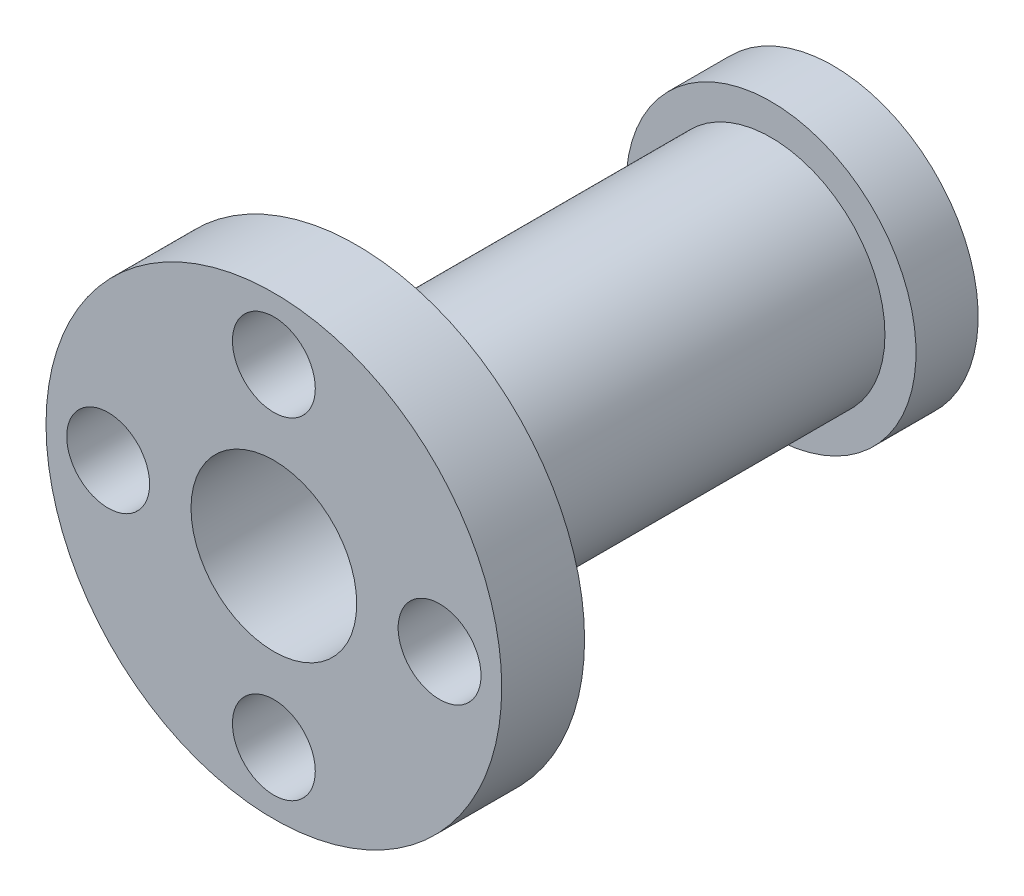
ISO-10303-21;
HEADER;
FILE_DESCRIPTION(('STEP AP214'),'2;1');
FILE_NAME('part.step','',(''),(''),'','','');
FILE_SCHEMA(('AUTOMOTIVE_DESIGN { 1 0 10303 214 1 1 1 1 }'));
ENDSEC;
DATA;
#1=APPLICATION_CONTEXT('core data for automotive mechanical design processes');
#2=APPLICATION_PROTOCOL_DEFINITION('international standard','automotive_design',2000,#1);
#3=PRODUCT_CONTEXT('',#1,'mechanical');
#4=PRODUCT('Part','Part','',(#3));
#5=PRODUCT_RELATED_PRODUCT_CATEGORY('part','',(#4));
#6=PRODUCT_DEFINITION_FORMATION('','',#4);
#7=PRODUCT_DEFINITION_CONTEXT('part definition',#1,'design');
#8=PRODUCT_DEFINITION('design','',#6,#7);
#9=PRODUCT_DEFINITION_SHAPE('','',#8);
#10=(LENGTH_UNIT() NAMED_UNIT(*) SI_UNIT(.MILLI.,.METRE.));
#11=(NAMED_UNIT(*) PLANE_ANGLE_UNIT() SI_UNIT($,.RADIAN.));
#12=(NAMED_UNIT(*) SI_UNIT($,.STERADIAN.) SOLID_ANGLE_UNIT());
#13=UNCERTAINTY_MEASURE_WITH_UNIT(LENGTH_MEASURE(1.E-05),#10,'distance_accuracy_value','');
#14=(GEOMETRIC_REPRESENTATION_CONTEXT(3) GLOBAL_UNCERTAINTY_ASSIGNED_CONTEXT((#13)) GLOBAL_UNIT_ASSIGNED_CONTEXT((#10,
#11,#12)) REPRESENTATION_CONTEXT('',''));
#15=CARTESIAN_POINT('',(0.,0.,0.));
#16=DIRECTION('',(0.,0.,1.));
#17=DIRECTION('',(1.,0.,0.));
#18=AXIS2_PLACEMENT_3D('',#15,#16,#17);
#19=CARTESIAN_POINT('',(0.,0.,0.));
#20=DIRECTION('',(0.,0.,1.));
#21=DIRECTION('',(1.,0.,0.));
#22=AXIS2_PLACEMENT_3D('',#19,#20,#21);
#23=PLANE('',#22);
#24=CARTESIAN_POINT('',(-8.,0.,0.));
#25=DIRECTION('',(0.,0.,1.));
#26=DIRECTION('',(1.,0.,0.));
#27=AXIS2_PLACEMENT_3D('',#24,#25,#26);
#28=CIRCLE('',#27,2.);
#29=CARTESIAN_POINT('',(-6.,0.,0.));
#30=VERTEX_POINT('',#29);
#31=EDGE_CURVE('E79',#30,#30,#28,.T.);
#32=ORIENTED_EDGE('',*,*,#31,.T.);
#33=EDGE_LOOP('',(#32));
#34=FACE_BOUND('',#33,.T.);
#35=CARTESIAN_POINT('',(0.,-8.,0.));
#36=DIRECTION('',(0.,0.,1.));
#37=DIRECTION('',(1.,0.,0.));
#38=AXIS2_PLACEMENT_3D('',#35,#36,#37);
#39=CIRCLE('',#38,2.);
#40=CARTESIAN_POINT('',(1.99999999999994,-8.,0.));
#41=VERTEX_POINT('',#40);
#42=EDGE_CURVE('E73',#41,#41,#39,.T.);
#43=ORIENTED_EDGE('',*,*,#42,.T.);
#44=EDGE_LOOP('',(#43));
#45=FACE_BOUND('',#44,.T.);
#46=CARTESIAN_POINT('',(8.,0.,0.));
#47=DIRECTION('',(0.,0.,1.));
#48=DIRECTION('',(1.,0.,0.));
#49=AXIS2_PLACEMENT_3D('',#46,#47,#48);
#50=CIRCLE('',#49,2.);
#51=CARTESIAN_POINT('',(10.,0.,0.));
#52=VERTEX_POINT('',#51);
#53=EDGE_CURVE('E67',#52,#52,#50,.T.);
#54=ORIENTED_EDGE('',*,*,#53,.T.);
#55=EDGE_LOOP('',(#54));
#56=FACE_BOUND('',#55,.T.);
#57=CARTESIAN_POINT('',(0.,8.,0.));
#58=DIRECTION('',(0.,0.,1.));
#59=DIRECTION('',(1.,0.,0.));
#60=AXIS2_PLACEMENT_3D('',#57,#58,#59);
#61=CIRCLE('',#60,2.);
#62=CARTESIAN_POINT('',(2.,8.,0.));
#63=VERTEX_POINT('',#62);
#64=EDGE_CURVE('E58',#63,#63,#61,.T.);
#65=ORIENTED_EDGE('',*,*,#64,.T.);
#66=EDGE_LOOP('',(#65));
#67=FACE_BOUND('',#66,.T.);
#68=CARTESIAN_POINT('',(0.,0.,0.));
#69=DIRECTION('',(0.,0.,1.));
#70=DIRECTION('',(1.,0.,0.));
#71=AXIS2_PLACEMENT_3D('',#68,#69,#70);
#72=CIRCLE('',#71,11.);
#73=CARTESIAN_POINT('',(11.,0.,0.));
#74=VERTEX_POINT('',#73);
#75=EDGE_CURVE('E51',#74,#74,#72,.T.);
#76=ORIENTED_EDGE('',*,*,#75,.F.);
#77=EDGE_LOOP('',(#76));
#78=FACE_BOUND('',#77,.T.);
#79=CARTESIAN_POINT('',(0.,0.,0.));
#80=DIRECTION('',(0.,0.,1.));
#81=DIRECTION('',(1.,0.,0.));
#82=AXIS2_PLACEMENT_3D('',#79,#80,#81);
#83=CIRCLE('',#82,5.5);
#84=CARTESIAN_POINT('',(5.5,0.,0.));
#85=VERTEX_POINT('',#84);
#86=EDGE_CURVE('E10',#85,#85,#83,.F.);
#87=ORIENTED_EDGE('',*,*,#86,.F.);
#88=EDGE_LOOP('',(#87));
#89=FACE_BOUND('',#88,.T.);
#90=ADVANCED_FACE('F40',(#34,#45,#56,#67,#78,#89),#23,.F.);
#91=CARTESIAN_POINT('',(0.,0.,4.));
#92=DIRECTION('',(0.,0.,1.));
#93=DIRECTION('',(1.,0.,0.));
#94=AXIS2_PLACEMENT_3D('',#91,#92,#93);
#95=PLANE('',#94);
#96=CARTESIAN_POINT('',(0.,-8.,4.));
#97=DIRECTION('',(0.,0.,1.));
#98=DIRECTION('',(1.,0.,0.));
#99=AXIS2_PLACEMENT_3D('',#96,#97,#98);
#100=CIRCLE('',#99,2.);
#101=CARTESIAN_POINT('',(1.99999999999994,-8.,4.));
#102=VERTEX_POINT('',#101);
#103=EDGE_CURVE('E70',#102,#102,#100,.T.);
#104=ORIENTED_EDGE('',*,*,#103,.F.);
#105=EDGE_LOOP('',(#104));
#106=FACE_BOUND('',#105,.T.);
#107=CARTESIAN_POINT('',(0.,0.,4.));
#108=DIRECTION('',(0.,0.,1.));
#109=DIRECTION('',(1.,0.,0.));
#110=AXIS2_PLACEMENT_3D('',#107,#108,#109);
#111=CIRCLE('',#110,4.);
#112=CARTESIAN_POINT('',(4.,0.,4.));
#113=VERTEX_POINT('',#112);
#114=EDGE_CURVE('E61',#113,#113,#111,.T.);
#115=ORIENTED_EDGE('',*,*,#114,.F.);
#116=EDGE_LOOP('',(#115));
#117=FACE_BOUND('',#116,.T.);
#118=CARTESIAN_POINT('',(0.,0.,4.));
#119=DIRECTION('',(0.,0.,1.));
#120=DIRECTION('',(1.,0.,0.));
#121=AXIS2_PLACEMENT_3D('',#118,#119,#120);
#122=CIRCLE('',#121,11.);
#123=CARTESIAN_POINT('',(11.,0.,4.));
#124=VERTEX_POINT('',#123);
#125=EDGE_CURVE('E47',#124,#124,#122,.T.);
#126=ORIENTED_EDGE('',*,*,#125,.T.);
#127=EDGE_LOOP('',(#126));
#128=FACE_BOUND('',#127,.T.);
#129=CARTESIAN_POINT('',(0.,8.,4.));
#130=DIRECTION('',(0.,0.,1.));
#131=DIRECTION('',(1.,0.,0.));
#132=AXIS2_PLACEMENT_3D('',#129,#130,#131);
#133=CIRCLE('',#132,2.);
#134=CARTESIAN_POINT('',(2.,8.,4.));
#135=VERTEX_POINT('',#134);
#136=EDGE_CURVE('E56',#135,#135,#133,.T.);
#137=ORIENTED_EDGE('',*,*,#136,.F.);
#138=EDGE_LOOP('',(#137));
#139=FACE_BOUND('',#138,.T.);
#140=CARTESIAN_POINT('',(8.,0.,4.));
#141=DIRECTION('',(0.,0.,1.));
#142=DIRECTION('',(1.,0.,0.));
#143=AXIS2_PLACEMENT_3D('',#140,#141,#142);
#144=CIRCLE('',#143,2.);
#145=CARTESIAN_POINT('',(10.,0.,4.));
#146=VERTEX_POINT('',#145);
#147=EDGE_CURVE('E66',#146,#146,#144,.T.);
#148=ORIENTED_EDGE('',*,*,#147,.F.);
#149=EDGE_LOOP('',(#148));
#150=FACE_BOUND('',#149,.T.);
#151=CARTESIAN_POINT('',(-8.,0.,4.));
#152=DIRECTION('',(0.,0.,1.));
#153=DIRECTION('',(1.,0.,0.));
#154=AXIS2_PLACEMENT_3D('',#151,#152,#153);
#155=CIRCLE('',#154,2.);
#156=CARTESIAN_POINT('',(-6.,0.,4.));
#157=VERTEX_POINT('',#156);
#158=EDGE_CURVE('E76',#157,#157,#155,.T.);
#159=ORIENTED_EDGE('',*,*,#158,.F.);
#160=EDGE_LOOP('',(#159));
#161=FACE_BOUND('',#160,.T.);
#162=ADVANCED_FACE('F116',(#106,#117,#128,#139,#150,#161),#95,.T.);
#163=CARTESIAN_POINT('',(0.,0.,4.));
#164=DIRECTION('',(0.,0.,-1.));
#165=DIRECTION('',(-1.,0.,0.));
#166=AXIS2_PLACEMENT_3D('',#163,#164,#165);
#167=CYLINDRICAL_SURFACE('',#166,11.);
#168=ORIENTED_EDGE('',*,*,#125,.F.);
#169=EDGE_LOOP('',(#168));
#170=FACE_BOUND('',#169,.T.);
#171=ORIENTED_EDGE('',*,*,#75,.T.);
#172=EDGE_LOOP('',(#171));
#173=FACE_BOUND('',#172,.T.);
#174=ADVANCED_FACE('F42',(#170,#173),#167,.T.);
#175=CARTESIAN_POINT('',(0.,8.,4.));
#176=DIRECTION('',(0.,0.,-1.));
#177=DIRECTION('',(-1.,0.,0.));
#178=AXIS2_PLACEMENT_3D('',#175,#176,#177);
#179=CYLINDRICAL_SURFACE('',#178,2.);
#180=ORIENTED_EDGE('',*,*,#136,.T.);
#181=EDGE_LOOP('',(#180));
#182=FACE_BOUND('',#181,.T.);
#183=ORIENTED_EDGE('',*,*,#64,.F.);
#184=EDGE_LOOP('',(#183));
#185=FACE_BOUND('',#184,.T.);
#186=ADVANCED_FACE('F125',(#182,#185),#179,.F.);
#187=CARTESIAN_POINT('',(0.,0.,4.));
#188=DIRECTION('',(0.,0.,-1.));
#189=DIRECTION('',(-1.,0.,0.));
#190=AXIS2_PLACEMENT_3D('',#187,#188,#189);
#191=CYLINDRICAL_SURFACE('',#190,4.);
#192=ORIENTED_EDGE('',*,*,#114,.T.);
#193=EDGE_LOOP('',(#192));
#194=FACE_BOUND('',#193,.T.);
#195=CARTESIAN_POINT('',(0.,0.,-23.));
#196=DIRECTION('',(0.,0.,-1.));
#197=DIRECTION('',(-1.,0.,0.));
#198=AXIS2_PLACEMENT_3D('',#195,#196,#197);
#199=CIRCLE('',#198,4.);
#200=CARTESIAN_POINT('',(-4.,0.,-23.));
#201=VERTEX_POINT('',#200);
#202=EDGE_CURVE('E91',#201,#201,#199,.T.);
#203=ORIENTED_EDGE('',*,*,#202,.T.);
#204=EDGE_LOOP('',(#203));
#205=FACE_BOUND('',#204,.T.);
#206=ADVANCED_FACE('F97',(#194,#205),#191,.F.);
#207=CARTESIAN_POINT('',(8.,0.,4.));
#208=DIRECTION('',(0.,0.,-1.));
#209=DIRECTION('',(-1.,0.,0.));
#210=AXIS2_PLACEMENT_3D('',#207,#208,#209);
#211=CYLINDRICAL_SURFACE('',#210,2.);
#212=ORIENTED_EDGE('',*,*,#147,.T.);
#213=EDGE_LOOP('',(#212));
#214=FACE_BOUND('',#213,.T.);
#215=ORIENTED_EDGE('',*,*,#53,.F.);
#216=EDGE_LOOP('',(#215));
#217=FACE_BOUND('',#216,.T.);
#218=ADVANCED_FACE('F131',(#214,#217),#211,.F.);
#219=CARTESIAN_POINT('',(0.,-8.,4.));
#220=DIRECTION('',(0.,0.,-1.));
#221=DIRECTION('',(-1.,0.,0.));
#222=AXIS2_PLACEMENT_3D('',#219,#220,#221);
#223=CYLINDRICAL_SURFACE('',#222,2.);
#224=ORIENTED_EDGE('',*,*,#103,.T.);
#225=EDGE_LOOP('',(#224));
#226=FACE_BOUND('',#225,.T.);
#227=ORIENTED_EDGE('',*,*,#42,.F.);
#228=EDGE_LOOP('',(#227));
#229=FACE_BOUND('',#228,.T.);
#230=ADVANCED_FACE('F135',(#226,#229),#223,.F.);
#231=CARTESIAN_POINT('',(-8.,0.,4.));
#232=DIRECTION('',(0.,0.,-1.));
#233=DIRECTION('',(-1.,0.,0.));
#234=AXIS2_PLACEMENT_3D('',#231,#232,#233);
#235=CYLINDRICAL_SURFACE('',#234,2.);
#236=ORIENTED_EDGE('',*,*,#158,.T.);
#237=EDGE_LOOP('',(#236));
#238=FACE_BOUND('',#237,.T.);
#239=ORIENTED_EDGE('',*,*,#31,.F.);
#240=EDGE_LOOP('',(#239));
#241=FACE_BOUND('',#240,.T.);
#242=ADVANCED_FACE('F112',(#238,#241),#235,.F.);
#243=CARTESIAN_POINT('',(0.,0.,-20.));
#244=DIRECTION('',(0.,0.,1.));
#245=DIRECTION('',(1.,0.,0.));
#246=AXIS2_PLACEMENT_3D('',#243,#244,#245);
#247=CYLINDRICAL_SURFACE('',#246,5.5);
#248=CARTESIAN_POINT('',(0.,0.,-20.));
#249=DIRECTION('',(0.,0.,-1.));
#250=DIRECTION('',(-1.,0.,0.));
#251=AXIS2_PLACEMENT_3D('',#248,#249,#250);
#252=CIRCLE('',#251,5.5);
#253=CARTESIAN_POINT('',(-5.5,0.,-20.));
#254=VERTEX_POINT('',#253);
#255=EDGE_CURVE('E82',#254,#254,#252,.T.);
#256=ORIENTED_EDGE('',*,*,#255,.F.);
#257=EDGE_LOOP('',(#256));
#258=FACE_BOUND('',#257,.T.);
#259=ORIENTED_EDGE('',*,*,#86,.T.);
#260=EDGE_LOOP('',(#259));
#261=FACE_BOUND('',#260,.T.);
#262=ADVANCED_FACE('F102',(#258,#261),#247,.T.);
#263=CARTESIAN_POINT('',(0.,0.,-23.));
#264=DIRECTION('',(0.,0.,-1.));
#265=DIRECTION('',(-1.,0.,0.));
#266=AXIS2_PLACEMENT_3D('',#263,#264,#265);
#267=PLANE('',#266);
#268=CARTESIAN_POINT('',(0.,0.,-23.));
#269=DIRECTION('',(0.,0.,-1.));
#270=DIRECTION('',(-1.,0.,0.));
#271=AXIS2_PLACEMENT_3D('',#268,#269,#270);
#272=CIRCLE('',#271,7.);
#273=CARTESIAN_POINT('',(-7.,0.,-23.));
#274=VERTEX_POINT('',#273);
#275=EDGE_CURVE('E87',#274,#274,#272,.T.);
#276=ORIENTED_EDGE('',*,*,#275,.T.);
#277=EDGE_LOOP('',(#276));
#278=FACE_BOUND('',#277,.T.);
#279=ORIENTED_EDGE('',*,*,#202,.F.);
#280=EDGE_LOOP('',(#279));
#281=FACE_BOUND('',#280,.T.);
#282=ADVANCED_FACE('F99',(#278,#281),#267,.T.);
#283=CARTESIAN_POINT('',(0.,0.,-20.));
#284=DIRECTION('',(0.,0.,-1.));
#285=DIRECTION('',(-1.,0.,0.));
#286=AXIS2_PLACEMENT_3D('',#283,#284,#285);
#287=PLANE('',#286);
#288=ORIENTED_EDGE('',*,*,#255,.T.);
#289=EDGE_LOOP('',(#288));
#290=FACE_BOUND('',#289,.T.);
#291=CARTESIAN_POINT('',(0.,0.,-20.));
#292=DIRECTION('',(0.,0.,-1.));
#293=DIRECTION('',(-1.,0.,0.));
#294=AXIS2_PLACEMENT_3D('',#291,#292,#293);
#295=CIRCLE('',#294,7.);
#296=CARTESIAN_POINT('',(-7.,0.,-20.));
#297=VERTEX_POINT('',#296);
#298=EDGE_CURVE('E88',#297,#297,#295,.T.);
#299=ORIENTED_EDGE('',*,*,#298,.F.);
#300=EDGE_LOOP('',(#299));
#301=FACE_BOUND('',#300,.T.);
#302=ADVANCED_FACE('F101',(#290,#301),#287,.F.);
#303=CARTESIAN_POINT('',(0.,0.,-23.));
#304=DIRECTION('',(0.,0.,1.));
#305=DIRECTION('',(1.,0.,0.));
#306=AXIS2_PLACEMENT_3D('',#303,#304,#305);
#307=CYLINDRICAL_SURFACE('',#306,7.);
#308=ORIENTED_EDGE('',*,*,#275,.F.);
#309=EDGE_LOOP('',(#308));
#310=FACE_BOUND('',#309,.T.);
#311=ORIENTED_EDGE('',*,*,#298,.T.);
#312=EDGE_LOOP('',(#311));
#313=FACE_BOUND('',#312,.T.);
#314=ADVANCED_FACE('F109',(#310,#313),#307,.T.);
#315=CLOSED_SHELL('',(#90,#162,#174,#186,#206,#218,#230,#242,#262,#282,#302,#314));
#316=MANIFOLD_SOLID_BREP('B2',#315);
#317=ADVANCED_BREP_SHAPE_REPRESENTATION('',(#18,#316),#14);
#318=SHAPE_DEFINITION_REPRESENTATION(#9,#317);
ENDSEC;
END-ISO-10303-21;
